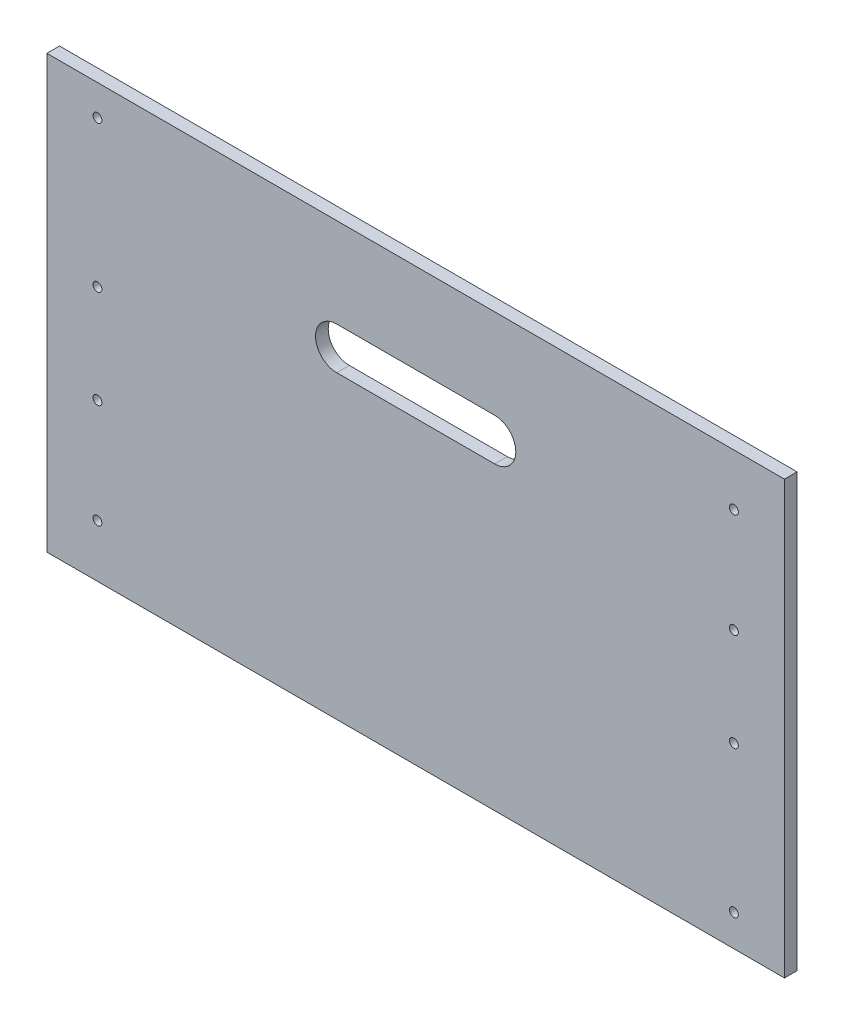
ISO-10303-21;
HEADER;
FILE_DESCRIPTION(('STEP AP214'),'2;1');
FILE_NAME('part.step','',(''),(''),'','','');
FILE_SCHEMA(('AUTOMOTIVE_DESIGN { 1 0 10303 214 1 1 1 1 }'));
ENDSEC;
DATA;
#1=APPLICATION_CONTEXT('core data for automotive mechanical design processes');
#2=APPLICATION_PROTOCOL_DEFINITION('international standard','automotive_design',2000,#1);
#3=PRODUCT_CONTEXT('',#1,'mechanical');
#4=PRODUCT('Part','Part','',(#3));
#5=PRODUCT_RELATED_PRODUCT_CATEGORY('part','',(#4));
#6=PRODUCT_DEFINITION_FORMATION('','',#4);
#7=PRODUCT_DEFINITION_CONTEXT('part definition',#1,'design');
#8=PRODUCT_DEFINITION('design','',#6,#7);
#9=PRODUCT_DEFINITION_SHAPE('','',#8);
#10=(LENGTH_UNIT() NAMED_UNIT(*) SI_UNIT(.MILLI.,.METRE.));
#11=(NAMED_UNIT(*) PLANE_ANGLE_UNIT() SI_UNIT($,.RADIAN.));
#12=(NAMED_UNIT(*) SI_UNIT($,.STERADIAN.) SOLID_ANGLE_UNIT());
#13=UNCERTAINTY_MEASURE_WITH_UNIT(LENGTH_MEASURE(1.E-05),#10,'distance_accuracy_value','');
#14=(GEOMETRIC_REPRESENTATION_CONTEXT(3) GLOBAL_UNCERTAINTY_ASSIGNED_CONTEXT((#13)) GLOBAL_UNIT_ASSIGNED_CONTEXT((#10,
#11,#12)) REPRESENTATION_CONTEXT('',''));
#15=CARTESIAN_POINT('',(0.,0.,0.));
#16=DIRECTION('',(0.,0.,1.));
#17=DIRECTION('',(1.,0.,0.));
#18=AXIS2_PLACEMENT_3D('',#15,#16,#17);
#19=CARTESIAN_POINT('',(0.,-102.5,6.));
#20=DIRECTION('',(0.,1.,0.));
#21=DIRECTION('',(0.,0.,1.));
#22=AXIS2_PLACEMENT_3D('',#19,#20,#21);
#23=PLANE('',#22);
#24=DIRECTION('',(1.,0.,0.));
#25=VECTOR('',#24,1.);
#26=CARTESIAN_POINT('',(0.,-102.5,0.));
#27=LINE('',#26,#25);
#28=CARTESIAN_POINT('',(-175.,-102.5,0.));
#29=VERTEX_POINT('',#28);
#30=CARTESIAN_POINT('',(175.,-102.5,0.));
#31=VERTEX_POINT('',#30);
#32=EDGE_CURVE('E141',#29,#31,#27,.T.);
#33=ORIENTED_EDGE('',*,*,#32,.T.);
#34=DIRECTION('',(0.,0.,-1.));
#35=VECTOR('',#34,1.);
#36=CARTESIAN_POINT('',(175.,-102.5,6.));
#37=LINE('',#36,#35);
#38=CARTESIAN_POINT('',(175.,-102.5,6.));
#39=VERTEX_POINT('',#38);
#40=EDGE_CURVE('E11',#39,#31,#37,.T.);
#41=ORIENTED_EDGE('',*,*,#40,.F.);
#42=DIRECTION('',(1.,0.,0.));
#43=VECTOR('',#42,1.);
#44=CARTESIAN_POINT('',(0.,-102.5,6.));
#45=LINE('',#44,#43);
#46=CARTESIAN_POINT('',(-175.,-102.5,6.));
#47=VERTEX_POINT('',#46);
#48=EDGE_CURVE('E145',#47,#39,#45,.T.);
#49=ORIENTED_EDGE('',*,*,#48,.F.);
#50=DIRECTION('',(0.,0.,-1.));
#51=VECTOR('',#50,1.);
#52=CARTESIAN_POINT('',(-175.,-102.5,6.));
#53=LINE('',#52,#51);
#54=EDGE_CURVE('E157',#47,#29,#53,.T.);
#55=ORIENTED_EDGE('',*,*,#54,.T.);
#56=EDGE_LOOP('',(#33,#41,#49,#55));
#57=FACE_BOUND('',#56,.T.);
#58=ADVANCED_FACE('F41',(#57),#23,.F.);
#59=CARTESIAN_POINT('',(175.,0.,6.));
#60=DIRECTION('',(-1.,0.,0.));
#61=DIRECTION('',(0.,0.,1.));
#62=AXIS2_PLACEMENT_3D('',#59,#60,#61);
#63=PLANE('',#62);
#64=DIRECTION('',(0.,1.,0.));
#65=VECTOR('',#64,1.);
#66=CARTESIAN_POINT('',(175.,0.,0.));
#67=LINE('',#66,#65);
#68=CARTESIAN_POINT('',(175.,102.5,0.));
#69=VERTEX_POINT('',#68);
#70=EDGE_CURVE('E160',#31,#69,#67,.T.);
#71=ORIENTED_EDGE('',*,*,#70,.T.);
#72=DIRECTION('',(0.,0.,-1.));
#73=VECTOR('',#72,1.);
#74=CARTESIAN_POINT('',(175.,102.5,6.));
#75=LINE('',#74,#73);
#76=CARTESIAN_POINT('',(175.,102.5,6.));
#77=VERTEX_POINT('',#76);
#78=EDGE_CURVE('E48',#77,#69,#75,.T.);
#79=ORIENTED_EDGE('',*,*,#78,.F.);
#80=DIRECTION('',(0.,1.,0.));
#81=VECTOR('',#80,1.);
#82=CARTESIAN_POINT('',(175.,0.,6.));
#83=LINE('',#82,#81);
#84=EDGE_CURVE('E148',#39,#77,#83,.T.);
#85=ORIENTED_EDGE('',*,*,#84,.F.);
#86=ORIENTED_EDGE('',*,*,#40,.T.);
#87=EDGE_LOOP('',(#71,#79,#85,#86));
#88=FACE_BOUND('',#87,.T.);
#89=ADVANCED_FACE('F176',(#88),#63,.F.);
#90=CARTESIAN_POINT('',(0.,102.5,6.));
#91=DIRECTION('',(0.,1.,0.));
#92=DIRECTION('',(0.,0.,1.));
#93=AXIS2_PLACEMENT_3D('',#90,#91,#92);
#94=PLANE('',#93);
#95=DIRECTION('',(1.,0.,0.));
#96=VECTOR('',#95,1.);
#97=CARTESIAN_POINT('',(0.,102.5,0.));
#98=LINE('',#97,#96);
#99=CARTESIAN_POINT('',(-175.,102.5,0.));
#100=VERTEX_POINT('',#99);
#101=EDGE_CURVE('E163',#100,#69,#98,.T.);
#102=ORIENTED_EDGE('',*,*,#101,.F.);
#103=DIRECTION('',(0.,0.,-1.));
#104=VECTOR('',#103,1.);
#105=CARTESIAN_POINT('',(-175.,102.5,6.));
#106=LINE('',#105,#104);
#107=CARTESIAN_POINT('',(-175.,102.5,6.));
#108=VERTEX_POINT('',#107);
#109=EDGE_CURVE('E169',#108,#100,#106,.T.);
#110=ORIENTED_EDGE('',*,*,#109,.F.);
#111=DIRECTION('',(1.,0.,0.));
#112=VECTOR('',#111,1.);
#113=CARTESIAN_POINT('',(0.,102.5,6.));
#114=LINE('',#113,#112);
#115=EDGE_CURVE('E151',#108,#77,#114,.T.);
#116=ORIENTED_EDGE('',*,*,#115,.T.);
#117=ORIENTED_EDGE('',*,*,#78,.T.);
#118=EDGE_LOOP('',(#102,#110,#116,#117));
#119=FACE_BOUND('',#118,.T.);
#120=ADVANCED_FACE('F173',(#119),#94,.T.);
#121=CARTESIAN_POINT('',(-175.,0.,6.));
#122=DIRECTION('',(-1.,0.,0.));
#123=DIRECTION('',(0.,0.,1.));
#124=AXIS2_PLACEMENT_3D('',#121,#122,#123);
#125=PLANE('',#124);
#126=DIRECTION('',(0.,1.,0.));
#127=VECTOR('',#126,1.);
#128=CARTESIAN_POINT('',(-175.,0.,0.));
#129=LINE('',#128,#127);
#130=EDGE_CURVE('E149',#29,#100,#129,.T.);
#131=ORIENTED_EDGE('',*,*,#130,.F.);
#132=ORIENTED_EDGE('',*,*,#54,.F.);
#133=DIRECTION('',(0.,1.,0.));
#134=VECTOR('',#133,1.);
#135=CARTESIAN_POINT('',(-175.,0.,6.));
#136=LINE('',#135,#134);
#137=EDGE_CURVE('E154',#47,#108,#136,.T.);
#138=ORIENTED_EDGE('',*,*,#137,.T.);
#139=ORIENTED_EDGE('',*,*,#109,.T.);
#140=EDGE_LOOP('',(#131,#132,#138,#139));
#141=FACE_BOUND('',#140,.T.);
#142=ADVANCED_FACE('F181',(#141),#125,.T.);
#143=CARTESIAN_POINT('',(0.,0.,6.));
#144=DIRECTION('',(0.,0.,1.));
#145=DIRECTION('',(1.,0.,0.));
#146=AXIS2_PLACEMENT_3D('',#143,#144,#145);
#147=PLANE('',#146);
#148=CARTESIAN_POINT('',(151.,-87.5,6.));
#149=DIRECTION('',(0.,0.,-1.));
#150=DIRECTION('',(-1.,0.,0.));
#151=AXIS2_PLACEMENT_3D('',#148,#149,#150);
#152=CIRCLE('',#151,2.09999999999999);
#153=CARTESIAN_POINT('',(148.9,-87.5,6.));
#154=VERTEX_POINT('',#153);
#155=EDGE_CURVE('E251',#154,#154,#152,.T.);
#156=ORIENTED_EDGE('',*,*,#155,.T.);
#157=EDGE_LOOP('',(#156));
#158=FACE_BOUND('',#157,.T.);
#159=CARTESIAN_POINT('',(151.,-18.,6.));
#160=DIRECTION('',(0.,0.,-1.));
#161=DIRECTION('',(-1.,0.,0.));
#162=AXIS2_PLACEMENT_3D('',#159,#160,#161);
#163=CIRCLE('',#162,2.09999999999999);
#164=CARTESIAN_POINT('',(148.9,-18.,6.));
#165=VERTEX_POINT('',#164);
#166=EDGE_CURVE('E261',#165,#165,#163,.T.);
#167=ORIENTED_EDGE('',*,*,#166,.T.);
#168=EDGE_LOOP('',(#167));
#169=FACE_BOUND('',#168,.T.);
#170=CARTESIAN_POINT('',(151.,28.5,6.));
#171=DIRECTION('',(0.,0.,-1.));
#172=DIRECTION('',(-1.,0.,0.));
#173=AXIS2_PLACEMENT_3D('',#170,#171,#172);
#174=CIRCLE('',#173,2.09999999999999);
#175=CARTESIAN_POINT('',(148.9,28.5,6.));
#176=VERTEX_POINT('',#175);
#177=EDGE_CURVE('E267',#176,#176,#174,.T.);
#178=ORIENTED_EDGE('',*,*,#177,.T.);
#179=EDGE_LOOP('',(#178));
#180=FACE_BOUND('',#179,.T.);
#181=CARTESIAN_POINT('',(151.,78.,6.));
#182=DIRECTION('',(0.,0.,-1.));
#183=DIRECTION('',(-1.,0.,0.));
#184=AXIS2_PLACEMENT_3D('',#181,#182,#183);
#185=CIRCLE('',#184,2.09999999999999);
#186=CARTESIAN_POINT('',(148.9,78.,6.));
#187=VERTEX_POINT('',#186);
#188=EDGE_CURVE('E273',#187,#187,#185,.T.);
#189=ORIENTED_EDGE('',*,*,#188,.T.);
#190=EDGE_LOOP('',(#189));
#191=FACE_BOUND('',#190,.T.);
#192=CARTESIAN_POINT('',(-151.,-77.5,6.));
#193=DIRECTION('',(0.,0.,-1.));
#194=DIRECTION('',(-1.,0.,0.));
#195=AXIS2_PLACEMENT_3D('',#192,#193,#194);
#196=CIRCLE('',#195,2.09999999999999);
#197=CARTESIAN_POINT('',(-153.1,-77.5,6.));
#198=VERTEX_POINT('',#197);
#199=EDGE_CURVE('E279',#198,#198,#196,.T.);
#200=ORIENTED_EDGE('',*,*,#199,.T.);
#201=EDGE_LOOP('',(#200));
#202=FACE_BOUND('',#201,.T.);
#203=CARTESIAN_POINT('',(-151.,-28.,6.));
#204=DIRECTION('',(0.,0.,-1.));
#205=DIRECTION('',(-1.,0.,0.));
#206=AXIS2_PLACEMENT_3D('',#203,#204,#205);
#207=CIRCLE('',#206,2.09999999999999);
#208=CARTESIAN_POINT('',(-153.1,-28.,6.));
#209=VERTEX_POINT('',#208);
#210=EDGE_CURVE('E285',#209,#209,#207,.T.);
#211=ORIENTED_EDGE('',*,*,#210,.T.);
#212=EDGE_LOOP('',(#211));
#213=FACE_BOUND('',#212,.T.);
#214=CARTESIAN_POINT('',(-151.,18.5,6.));
#215=DIRECTION('',(0.,0.,-1.));
#216=DIRECTION('',(-1.,0.,0.));
#217=AXIS2_PLACEMENT_3D('',#214,#215,#216);
#218=CIRCLE('',#217,2.09999999999999);
#219=CARTESIAN_POINT('',(-153.1,18.5,6.));
#220=VERTEX_POINT('',#219);
#221=EDGE_CURVE('E291',#220,#220,#218,.T.);
#222=ORIENTED_EDGE('',*,*,#221,.T.);
#223=EDGE_LOOP('',(#222));
#224=FACE_BOUND('',#223,.T.);
#225=CARTESIAN_POINT('',(-151.,88.0000000000001,6.));
#226=DIRECTION('',(0.,0.,-1.));
#227=DIRECTION('',(-1.,0.,0.));
#228=AXIS2_PLACEMENT_3D('',#225,#226,#227);
#229=CIRCLE('',#228,2.09999999999999);
#230=CARTESIAN_POINT('',(-153.1,88.0000000000001,6.));
#231=VERTEX_POINT('',#230);
#232=EDGE_CURVE('E129',#231,#231,#229,.T.);
#233=ORIENTED_EDGE('',*,*,#232,.T.);
#234=EDGE_LOOP('',(#233));
#235=FACE_BOUND('',#234,.T.);
#236=CARTESIAN_POINT('',(-37.5,50.,6.));
#237=DIRECTION('',(0.,0.,1.));
#238=DIRECTION('',(1.,0.,0.));
#239=AXIS2_PLACEMENT_3D('',#236,#237,#238);
#240=CIRCLE('',#239,10.);
#241=CARTESIAN_POINT('',(-37.5,60.,6.));
#242=VERTEX_POINT('',#241);
#243=CARTESIAN_POINT('',(-37.5,40.,6.));
#244=VERTEX_POINT('',#243);
#245=EDGE_CURVE('E55',#242,#244,#240,.T.);
#246=ORIENTED_EDGE('',*,*,#245,.F.);
#247=DIRECTION('',(-1.,0.,0.));
#248=VECTOR('',#247,1.);
#249=CARTESIAN_POINT('',(-37.5,60.,6.));
#250=LINE('',#249,#248);
#251=CARTESIAN_POINT('',(37.5,60.,6.));
#252=VERTEX_POINT('',#251);
#253=EDGE_CURVE('E123',#252,#242,#250,.T.);
#254=ORIENTED_EDGE('',*,*,#253,.F.);
#255=CARTESIAN_POINT('',(37.5,50.,6.));
#256=DIRECTION('',(0.,0.,1.));
#257=DIRECTION('',(1.,0.,0.));
#258=AXIS2_PLACEMENT_3D('',#255,#256,#257);
#259=CIRCLE('',#258,10.);
#260=CARTESIAN_POINT('',(37.5,40.,6.));
#261=VERTEX_POINT('',#260);
#262=EDGE_CURVE('E126',#261,#252,#259,.T.);
#263=ORIENTED_EDGE('',*,*,#262,.F.);
#264=DIRECTION('',(1.,0.,0.));
#265=VECTOR('',#264,1.);
#266=CARTESIAN_POINT('',(-37.5,40.,6.));
#267=LINE('',#266,#265);
#268=EDGE_CURVE('E135',#244,#261,#267,.T.);
#269=ORIENTED_EDGE('',*,*,#268,.F.);
#270=EDGE_LOOP('',(#246,#254,#263,#269));
#271=FACE_BOUND('',#270,.T.);
#272=ORIENTED_EDGE('',*,*,#48,.T.);
#273=ORIENTED_EDGE('',*,*,#84,.T.);
#274=ORIENTED_EDGE('',*,*,#115,.F.);
#275=ORIENTED_EDGE('',*,*,#137,.F.);
#276=EDGE_LOOP('',(#272,#273,#274,#275));
#277=FACE_BOUND('',#276,.T.);
#278=ADVANCED_FACE('F185',(#158,#169,#180,#191,#202,#213,#224,#235,#271,#277),#147,.T.);
#279=CARTESIAN_POINT('',(0.,0.,0.));
#280=DIRECTION('',(0.,0.,1.));
#281=DIRECTION('',(1.,0.,0.));
#282=AXIS2_PLACEMENT_3D('',#279,#280,#281);
#283=PLANE('',#282);
#284=CARTESIAN_POINT('',(151.,-87.5,0.));
#285=DIRECTION('',(0.,0.,-1.));
#286=DIRECTION('',(-1.,0.,0.));
#287=AXIS2_PLACEMENT_3D('',#284,#285,#286);
#288=CIRCLE('',#287,2.09999999999999);
#289=CARTESIAN_POINT('',(148.9,-87.5,0.));
#290=VERTEX_POINT('',#289);
#291=EDGE_CURVE('E254',#290,#290,#288,.T.);
#292=ORIENTED_EDGE('',*,*,#291,.F.);
#293=EDGE_LOOP('',(#292));
#294=FACE_BOUND('',#293,.T.);
#295=CARTESIAN_POINT('',(151.,-18.,0.));
#296=DIRECTION('',(0.,0.,-1.));
#297=DIRECTION('',(-1.,0.,0.));
#298=AXIS2_PLACEMENT_3D('',#295,#296,#297);
#299=CIRCLE('',#298,2.09999999999999);
#300=CARTESIAN_POINT('',(148.9,-18.,0.));
#301=VERTEX_POINT('',#300);
#302=EDGE_CURVE('E256',#301,#301,#299,.T.);
#303=ORIENTED_EDGE('',*,*,#302,.F.);
#304=EDGE_LOOP('',(#303));
#305=FACE_BOUND('',#304,.T.);
#306=CARTESIAN_POINT('',(151.,28.5,0.));
#307=DIRECTION('',(0.,0.,-1.));
#308=DIRECTION('',(-1.,0.,0.));
#309=AXIS2_PLACEMENT_3D('',#306,#307,#308);
#310=CIRCLE('',#309,2.09999999999999);
#311=CARTESIAN_POINT('',(148.9,28.5,0.));
#312=VERTEX_POINT('',#311);
#313=EDGE_CURVE('E264',#312,#312,#310,.T.);
#314=ORIENTED_EDGE('',*,*,#313,.F.);
#315=EDGE_LOOP('',(#314));
#316=FACE_BOUND('',#315,.T.);
#317=CARTESIAN_POINT('',(151.,78.,0.));
#318=DIRECTION('',(0.,0.,-1.));
#319=DIRECTION('',(-1.,0.,0.));
#320=AXIS2_PLACEMENT_3D('',#317,#318,#319);
#321=CIRCLE('',#320,2.09999999999999);
#322=CARTESIAN_POINT('',(148.9,78.,0.));
#323=VERTEX_POINT('',#322);
#324=EDGE_CURVE('E270',#323,#323,#321,.T.);
#325=ORIENTED_EDGE('',*,*,#324,.F.);
#326=EDGE_LOOP('',(#325));
#327=FACE_BOUND('',#326,.T.);
#328=CARTESIAN_POINT('',(-151.,-77.5,0.));
#329=DIRECTION('',(0.,0.,-1.));
#330=DIRECTION('',(-1.,0.,0.));
#331=AXIS2_PLACEMENT_3D('',#328,#329,#330);
#332=CIRCLE('',#331,2.09999999999999);
#333=CARTESIAN_POINT('',(-153.1,-77.5,0.));
#334=VERTEX_POINT('',#333);
#335=EDGE_CURVE('E276',#334,#334,#332,.T.);
#336=ORIENTED_EDGE('',*,*,#335,.F.);
#337=EDGE_LOOP('',(#336));
#338=FACE_BOUND('',#337,.T.);
#339=CARTESIAN_POINT('',(-151.,-28.,0.));
#340=DIRECTION('',(0.,0.,-1.));
#341=DIRECTION('',(-1.,0.,0.));
#342=AXIS2_PLACEMENT_3D('',#339,#340,#341);
#343=CIRCLE('',#342,2.09999999999999);
#344=CARTESIAN_POINT('',(-153.1,-28.,0.));
#345=VERTEX_POINT('',#344);
#346=EDGE_CURVE('E282',#345,#345,#343,.T.);
#347=ORIENTED_EDGE('',*,*,#346,.F.);
#348=EDGE_LOOP('',(#347));
#349=FACE_BOUND('',#348,.T.);
#350=CARTESIAN_POINT('',(-151.,18.5,0.));
#351=DIRECTION('',(0.,0.,-1.));
#352=DIRECTION('',(-1.,0.,0.));
#353=AXIS2_PLACEMENT_3D('',#350,#351,#352);
#354=CIRCLE('',#353,2.09999999999999);
#355=CARTESIAN_POINT('',(-153.1,18.5,0.));
#356=VERTEX_POINT('',#355);
#357=EDGE_CURVE('E288',#356,#356,#354,.T.);
#358=ORIENTED_EDGE('',*,*,#357,.F.);
#359=EDGE_LOOP('',(#358));
#360=FACE_BOUND('',#359,.T.);
#361=CARTESIAN_POINT('',(-151.,88.0000000000001,0.));
#362=DIRECTION('',(0.,0.,-1.));
#363=DIRECTION('',(-1.,0.,0.));
#364=AXIS2_PLACEMENT_3D('',#361,#362,#363);
#365=CIRCLE('',#364,2.09999999999999);
#366=CARTESIAN_POINT('',(-153.1,88.0000000000001,0.));
#367=VERTEX_POINT('',#366);
#368=EDGE_CURVE('E293',#367,#367,#365,.T.);
#369=ORIENTED_EDGE('',*,*,#368,.F.);
#370=EDGE_LOOP('',(#369));
#371=FACE_BOUND('',#370,.T.);
#372=DIRECTION('',(-1.,0.,0.));
#373=VECTOR('',#372,1.);
#374=CARTESIAN_POINT('',(-37.5,60.,0.));
#375=LINE('',#374,#373);
#376=CARTESIAN_POINT('',(37.5,60.,0.));
#377=VERTEX_POINT('',#376);
#378=CARTESIAN_POINT('',(-37.5,60.,0.));
#379=VERTEX_POINT('',#378);
#380=EDGE_CURVE('E113',#377,#379,#375,.T.);
#381=ORIENTED_EDGE('',*,*,#380,.T.);
#382=CARTESIAN_POINT('',(-37.5,50.,0.));
#383=DIRECTION('',(0.,0.,1.));
#384=DIRECTION('',(1.,0.,0.));
#385=AXIS2_PLACEMENT_3D('',#382,#383,#384);
#386=CIRCLE('',#385,10.);
#387=CARTESIAN_POINT('',(-37.5,40.,0.));
#388=VERTEX_POINT('',#387);
#389=EDGE_CURVE('E107',#379,#388,#386,.T.);
#390=ORIENTED_EDGE('',*,*,#389,.T.);
#391=DIRECTION('',(1.,0.,0.));
#392=VECTOR('',#391,1.);
#393=CARTESIAN_POINT('',(-37.5,40.,0.));
#394=LINE('',#393,#392);
#395=CARTESIAN_POINT('',(37.5,40.,0.));
#396=VERTEX_POINT('',#395);
#397=EDGE_CURVE('E116',#388,#396,#394,.T.);
#398=ORIENTED_EDGE('',*,*,#397,.T.);
#399=CARTESIAN_POINT('',(37.5,50.,0.));
#400=DIRECTION('',(0.,0.,1.));
#401=DIRECTION('',(1.,0.,0.));
#402=AXIS2_PLACEMENT_3D('',#399,#400,#401);
#403=CIRCLE('',#402,10.);
#404=EDGE_CURVE('E63',#396,#377,#403,.T.);
#405=ORIENTED_EDGE('',*,*,#404,.T.);
#406=EDGE_LOOP('',(#381,#390,#398,#405));
#407=FACE_BOUND('',#406,.T.);
#408=ORIENTED_EDGE('',*,*,#32,.F.);
#409=ORIENTED_EDGE('',*,*,#130,.T.);
#410=ORIENTED_EDGE('',*,*,#101,.T.);
#411=ORIENTED_EDGE('',*,*,#70,.F.);
#412=EDGE_LOOP('',(#408,#409,#410,#411));
#413=FACE_BOUND('',#412,.T.);
#414=ADVANCED_FACE('F120',(#294,#305,#316,#327,#338,#349,#360,#371,#407,#413),#283,.F.);
#415=CARTESIAN_POINT('',(-37.5,50.,0.));
#416=DIRECTION('',(0.,0.,1.));
#417=DIRECTION('',(1.,0.,0.));
#418=AXIS2_PLACEMENT_3D('',#415,#416,#417);
#419=CYLINDRICAL_SURFACE('',#418,10.);
#420=ORIENTED_EDGE('',*,*,#245,.T.);
#421=DIRECTION('',(0.,0.,1.));
#422=VECTOR('',#421,1.);
#423=CARTESIAN_POINT('',(-37.5,40.,0.));
#424=LINE('',#423,#422);
#425=EDGE_CURVE('E103',#388,#244,#424,.T.);
#426=ORIENTED_EDGE('',*,*,#425,.F.);
#427=ORIENTED_EDGE('',*,*,#389,.F.);
#428=DIRECTION('',(0.,0.,1.));
#429=VECTOR('',#428,1.);
#430=CARTESIAN_POINT('',(-37.5,60.,0.));
#431=LINE('',#430,#429);
#432=EDGE_CURVE('E139',#379,#242,#431,.T.);
#433=ORIENTED_EDGE('',*,*,#432,.T.);
#434=EDGE_LOOP('',(#420,#426,#427,#433));
#435=FACE_BOUND('',#434,.T.);
#436=ADVANCED_FACE('F105',(#435),#419,.F.);
#437=CARTESIAN_POINT('',(-37.5,60.,0.));
#438=DIRECTION('',(0.,1.,0.));
#439=DIRECTION('',(0.,0.,1.));
#440=AXIS2_PLACEMENT_3D('',#437,#438,#439);
#441=PLANE('',#440);
#442=ORIENTED_EDGE('',*,*,#253,.T.);
#443=ORIENTED_EDGE('',*,*,#432,.F.);
#444=ORIENTED_EDGE('',*,*,#380,.F.);
#445=DIRECTION('',(0.,0.,1.));
#446=VECTOR('',#445,1.);
#447=CARTESIAN_POINT('',(37.5,60.,0.));
#448=LINE('',#447,#446);
#449=EDGE_CURVE('E142',#377,#252,#448,.T.);
#450=ORIENTED_EDGE('',*,*,#449,.T.);
#451=EDGE_LOOP('',(#442,#443,#444,#450));
#452=FACE_BOUND('',#451,.T.);
#453=ADVANCED_FACE('F206',(#452),#441,.F.);
#454=CARTESIAN_POINT('',(37.5,50.,0.));
#455=DIRECTION('',(0.,0.,1.));
#456=DIRECTION('',(1.,0.,0.));
#457=AXIS2_PLACEMENT_3D('',#454,#455,#456);
#458=CYLINDRICAL_SURFACE('',#457,10.);
#459=ORIENTED_EDGE('',*,*,#262,.T.);
#460=ORIENTED_EDGE('',*,*,#449,.F.);
#461=ORIENTED_EDGE('',*,*,#404,.F.);
#462=DIRECTION('',(0.,0.,1.));
#463=VECTOR('',#462,1.);
#464=CARTESIAN_POINT('',(37.5,40.,0.));
#465=LINE('',#464,#463);
#466=EDGE_CURVE('E112',#396,#261,#465,.T.);
#467=ORIENTED_EDGE('',*,*,#466,.T.);
#468=EDGE_LOOP('',(#459,#460,#461,#467));
#469=FACE_BOUND('',#468,.T.);
#470=ADVANCED_FACE('F210',(#469),#458,.F.);
#471=CARTESIAN_POINT('',(-37.5,40.,0.));
#472=DIRECTION('',(0.,-1.,0.));
#473=DIRECTION('',(0.,0.,-1.));
#474=AXIS2_PLACEMENT_3D('',#471,#472,#473);
#475=PLANE('',#474);
#476=ORIENTED_EDGE('',*,*,#268,.T.);
#477=ORIENTED_EDGE('',*,*,#466,.F.);
#478=ORIENTED_EDGE('',*,*,#397,.F.);
#479=ORIENTED_EDGE('',*,*,#425,.T.);
#480=EDGE_LOOP('',(#476,#477,#478,#479));
#481=FACE_BOUND('',#480,.T.);
#482=ADVANCED_FACE('F117',(#481),#475,.F.);
#483=CARTESIAN_POINT('',(-151.,88.0000000000001,0.));
#484=DIRECTION('',(0.,0.,-1.));
#485=DIRECTION('',(-1.,0.,0.));
#486=AXIS2_PLACEMENT_3D('',#483,#484,#485);
#487=CYLINDRICAL_SURFACE('',#486,2.09999999999999);
#488=ORIENTED_EDGE('',*,*,#232,.F.);
#489=EDGE_LOOP('',(#488));
#490=FACE_BOUND('',#489,.T.);
#491=ORIENTED_EDGE('',*,*,#368,.T.);
#492=EDGE_LOOP('',(#491));
#493=FACE_BOUND('',#492,.T.);
#494=ADVANCED_FACE('F209',(#490,#493),#487,.F.);
#495=CARTESIAN_POINT('',(-151.,18.5,0.));
#496=DIRECTION('',(0.,0.,-1.));
#497=DIRECTION('',(-1.,0.,0.));
#498=AXIS2_PLACEMENT_3D('',#495,#496,#497);
#499=CYLINDRICAL_SURFACE('',#498,2.09999999999999);
#500=ORIENTED_EDGE('',*,*,#221,.F.);
#501=EDGE_LOOP('',(#500));
#502=FACE_BOUND('',#501,.T.);
#503=ORIENTED_EDGE('',*,*,#357,.T.);
#504=EDGE_LOOP('',(#503));
#505=FACE_BOUND('',#504,.T.);
#506=ADVANCED_FACE('F218',(#502,#505),#499,.F.);
#507=CARTESIAN_POINT('',(-151.,-28.,0.));
#508=DIRECTION('',(0.,0.,-1.));
#509=DIRECTION('',(-1.,0.,0.));
#510=AXIS2_PLACEMENT_3D('',#507,#508,#509);
#511=CYLINDRICAL_SURFACE('',#510,2.09999999999999);
#512=ORIENTED_EDGE('',*,*,#210,.F.);
#513=EDGE_LOOP('',(#512));
#514=FACE_BOUND('',#513,.T.);
#515=ORIENTED_EDGE('',*,*,#346,.T.);
#516=EDGE_LOOP('',(#515));
#517=FACE_BOUND('',#516,.T.);
#518=ADVANCED_FACE('F222',(#514,#517),#511,.F.);
#519=CARTESIAN_POINT('',(-151.,-77.5,0.));
#520=DIRECTION('',(0.,0.,-1.));
#521=DIRECTION('',(-1.,0.,0.));
#522=AXIS2_PLACEMENT_3D('',#519,#520,#521);
#523=CYLINDRICAL_SURFACE('',#522,2.09999999999999);
#524=ORIENTED_EDGE('',*,*,#199,.F.);
#525=EDGE_LOOP('',(#524));
#526=FACE_BOUND('',#525,.T.);
#527=ORIENTED_EDGE('',*,*,#335,.T.);
#528=EDGE_LOOP('',(#527));
#529=FACE_BOUND('',#528,.T.);
#530=ADVANCED_FACE('F226',(#526,#529),#523,.F.);
#531=CARTESIAN_POINT('',(151.,78.,0.));
#532=DIRECTION('',(0.,0.,-1.));
#533=DIRECTION('',(-1.,0.,0.));
#534=AXIS2_PLACEMENT_3D('',#531,#532,#533);
#535=CYLINDRICAL_SURFACE('',#534,2.09999999999999);
#536=ORIENTED_EDGE('',*,*,#188,.F.);
#537=EDGE_LOOP('',(#536));
#538=FACE_BOUND('',#537,.T.);
#539=ORIENTED_EDGE('',*,*,#324,.T.);
#540=EDGE_LOOP('',(#539));
#541=FACE_BOUND('',#540,.T.);
#542=ADVANCED_FACE('F230',(#538,#541),#535,.F.);
#543=CARTESIAN_POINT('',(151.,28.5,0.));
#544=DIRECTION('',(0.,0.,-1.));
#545=DIRECTION('',(-1.,0.,0.));
#546=AXIS2_PLACEMENT_3D('',#543,#544,#545);
#547=CYLINDRICAL_SURFACE('',#546,2.09999999999999);
#548=ORIENTED_EDGE('',*,*,#177,.F.);
#549=EDGE_LOOP('',(#548));
#550=FACE_BOUND('',#549,.T.);
#551=ORIENTED_EDGE('',*,*,#313,.T.);
#552=EDGE_LOOP('',(#551));
#553=FACE_BOUND('',#552,.T.);
#554=ADVANCED_FACE('F234',(#550,#553),#547,.F.);
#555=CARTESIAN_POINT('',(151.,-18.,0.));
#556=DIRECTION('',(0.,0.,-1.));
#557=DIRECTION('',(-1.,0.,0.));
#558=AXIS2_PLACEMENT_3D('',#555,#556,#557);
#559=CYLINDRICAL_SURFACE('',#558,2.09999999999999);
#560=ORIENTED_EDGE('',*,*,#166,.F.);
#561=EDGE_LOOP('',(#560));
#562=FACE_BOUND('',#561,.T.);
#563=ORIENTED_EDGE('',*,*,#302,.T.);
#564=EDGE_LOOP('',(#563));
#565=FACE_BOUND('',#564,.T.);
#566=ADVANCED_FACE('F238',(#562,#565),#559,.F.);
#567=CARTESIAN_POINT('',(151.,-87.5,0.));
#568=DIRECTION('',(0.,0.,-1.));
#569=DIRECTION('',(-1.,0.,0.));
#570=AXIS2_PLACEMENT_3D('',#567,#568,#569);
#571=CYLINDRICAL_SURFACE('',#570,2.09999999999999);
#572=ORIENTED_EDGE('',*,*,#155,.F.);
#573=EDGE_LOOP('',(#572));
#574=FACE_BOUND('',#573,.T.);
#575=ORIENTED_EDGE('',*,*,#291,.T.);
#576=EDGE_LOOP('',(#575));
#577=FACE_BOUND('',#576,.T.);
#578=ADVANCED_FACE('F242',(#574,#577),#571,.F.);
#579=CLOSED_SHELL('',(#58,#89,#120,#142,#278,#414,#436,#453,#470,#482,#494,#506,#518,#530,#542,
#554,#566,#578));
#580=MANIFOLD_SOLID_BREP('B2',#579);
#581=ADVANCED_BREP_SHAPE_REPRESENTATION('',(#18,#580),#14);
#582=SHAPE_DEFINITION_REPRESENTATION(#9,#581);
ENDSEC;
END-ISO-10303-21;
